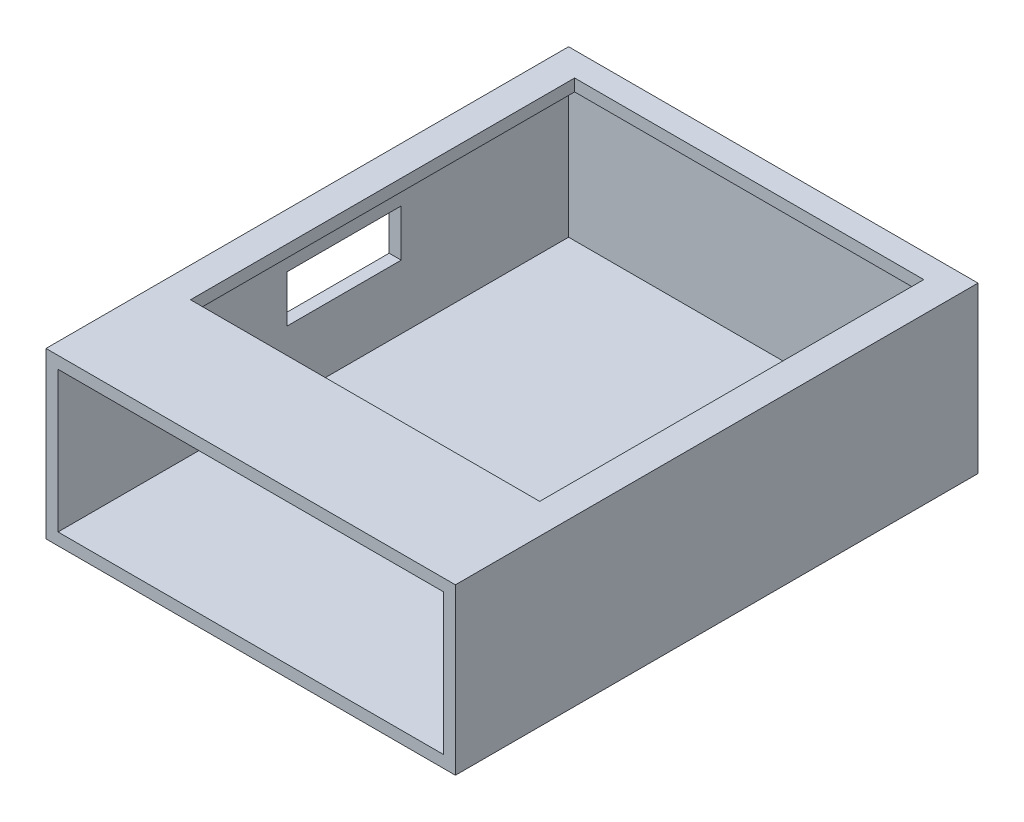
ISO-10303-21;
HEADER;
FILE_DESCRIPTION(('STEP AP214'),'2;1');
FILE_NAME('part.step','',(''),(''),'','','');
FILE_SCHEMA(('AUTOMOTIVE_DESIGN { 1 0 10303 214 1 1 1 1 }'));
ENDSEC;
DATA;
#1=APPLICATION_CONTEXT('core data for automotive mechanical design processes');
#2=APPLICATION_PROTOCOL_DEFINITION('international standard','automotive_design',2000,#1);
#3=PRODUCT_CONTEXT('',#1,'mechanical');
#4=PRODUCT('Part','Part','',(#3));
#5=PRODUCT_RELATED_PRODUCT_CATEGORY('part','',(#4));
#6=PRODUCT_DEFINITION_FORMATION('','',#4);
#7=PRODUCT_DEFINITION_CONTEXT('part definition',#1,'design');
#8=PRODUCT_DEFINITION('design','',#6,#7);
#9=PRODUCT_DEFINITION_SHAPE('','',#8);
#10=(LENGTH_UNIT() NAMED_UNIT(*) SI_UNIT(.MILLI.,.METRE.));
#11=(NAMED_UNIT(*) PLANE_ANGLE_UNIT() SI_UNIT($,.RADIAN.));
#12=(NAMED_UNIT(*) SI_UNIT($,.STERADIAN.) SOLID_ANGLE_UNIT());
#13=UNCERTAINTY_MEASURE_WITH_UNIT(LENGTH_MEASURE(1.E-05),#10,'distance_accuracy_value','');
#14=(GEOMETRIC_REPRESENTATION_CONTEXT(3) GLOBAL_UNCERTAINTY_ASSIGNED_CONTEXT((#13)) GLOBAL_UNIT_ASSIGNED_CONTEXT((#10,
#11,#12)) REPRESENTATION_CONTEXT('',''));
#15=CARTESIAN_POINT('',(0.,0.,0.));
#16=DIRECTION('',(0.,0.,1.));
#17=DIRECTION('',(1.,0.,0.));
#18=AXIS2_PLACEMENT_3D('',#15,#16,#17);
#19=CARTESIAN_POINT('',(-1.,11.7,-42.4));
#20=DIRECTION('',(1.,0.,0.));
#21=DIRECTION('',(0.,0.,-1.));
#22=AXIS2_PLACEMENT_3D('',#19,#20,#21);
#23=PLANE('',#22);
#24=DIRECTION('',(0.,0.,-1.));
#25=VECTOR('',#24,1.);
#26=CARTESIAN_POINT('',(-1.,5.3,-19.));
#27=LINE('',#26,#25);
#28=CARTESIAN_POINT('',(-1.,5.3,-19.));
#29=VERTEX_POINT('',#28);
#30=CARTESIAN_POINT('',(-1.,5.3,-28.5));
#31=VERTEX_POINT('',#30);
#32=EDGE_CURVE('E92',#29,#31,#27,.T.);
#33=ORIENTED_EDGE('',*,*,#32,.T.);
#34=DIRECTION('',(0.,1.,0.));
#35=VECTOR('',#34,1.);
#36=CARTESIAN_POINT('',(-1.,5.3,-28.5));
#37=LINE('',#36,#35);
#38=CARTESIAN_POINT('',(-1.,9.2,-28.5));
#39=VERTEX_POINT('',#38);
#40=EDGE_CURVE('E350',#31,#39,#37,.T.);
#41=ORIENTED_EDGE('',*,*,#40,.T.);
#42=DIRECTION('',(0.,0.,1.));
#43=VECTOR('',#42,1.);
#44=CARTESIAN_POINT('',(-1.,9.2,-28.5));
#45=LINE('',#44,#43);
#46=CARTESIAN_POINT('',(-1.,9.2,-19.));
#47=VERTEX_POINT('',#46);
#48=EDGE_CURVE('E346',#39,#47,#45,.T.);
#49=ORIENTED_EDGE('',*,*,#48,.T.);
#50=DIRECTION('',(0.,-1.,0.));
#51=VECTOR('',#50,1.);
#52=CARTESIAN_POINT('',(-1.,9.2,-19.));
#53=LINE('',#52,#51);
#54=EDGE_CURVE('E342',#47,#29,#53,.T.);
#55=ORIENTED_EDGE('',*,*,#54,.T.);
#56=EDGE_LOOP('',(#33,#41,#49,#55));
#57=FACE_BOUND('',#56,.T.);
#58=DIRECTION('',(0.,0.,1.));
#59=VECTOR('',#58,1.);
#60=CARTESIAN_POINT('',(-1.,-1.,-42.4));
#61=LINE('',#60,#59);
#62=CARTESIAN_POINT('',(-1.,-1.,-43.4));
#63=VERTEX_POINT('',#62);
#64=CARTESIAN_POINT('',(-1.,-1.,0.));
#65=VERTEX_POINT('',#64);
#66=EDGE_CURVE('E405',#63,#65,#61,.T.);
#67=ORIENTED_EDGE('',*,*,#66,.T.);
#68=DIRECTION('',(0.,-1.,0.));
#69=VECTOR('',#68,1.);
#70=CARTESIAN_POINT('',(-1.,11.7,0.));
#71=LINE('',#70,#69);
#72=CARTESIAN_POINT('',(-1.,12.7,0.));
#73=VERTEX_POINT('',#72);
#74=EDGE_CURVE('E12',#73,#65,#71,.T.);
#75=ORIENTED_EDGE('',*,*,#74,.F.);
#76=DIRECTION('',(0.,0.,1.));
#77=VECTOR('',#76,1.);
#78=CARTESIAN_POINT('',(-1.,12.7,-43.4));
#79=LINE('',#78,#77);
#80=CARTESIAN_POINT('',(-1.,12.7,-43.4));
#81=VERTEX_POINT('',#80);
#82=EDGE_CURVE('E272',#81,#73,#79,.T.);
#83=ORIENTED_EDGE('',*,*,#82,.F.);
#84=DIRECTION('',(0.,-1.,0.));
#85=VECTOR('',#84,1.);
#86=CARTESIAN_POINT('',(-1.,11.7,-43.4));
#87=LINE('',#86,#85);
#88=EDGE_CURVE('E410',#81,#63,#87,.T.);
#89=ORIENTED_EDGE('',*,*,#88,.T.);
#90=EDGE_LOOP('',(#67,#75,#83,#89));
#91=FACE_BOUND('',#90,.T.);
#92=DIRECTION('',(0.,1.,0.));
#93=VECTOR('',#92,1.);
#94=CARTESIAN_POINT('',(-1.,6.1,-12.85));
#95=LINE('',#94,#93);
#96=CARTESIAN_POINT('',(-1.,6.1,-12.85));
#97=VERTEX_POINT('',#96);
#98=CARTESIAN_POINT('',(-1.,8.3,-12.85));
#99=VERTEX_POINT('',#98);
#100=EDGE_CURVE('E84',#97,#99,#95,.T.);
#101=ORIENTED_EDGE('',*,*,#100,.T.);
#102=DIRECTION('',(0.,0.,1.));
#103=VECTOR('',#102,1.);
#104=CARTESIAN_POINT('',(-1.,8.3,-11.25));
#105=LINE('',#104,#103);
#106=CARTESIAN_POINT('',(-1.,8.3,-9.65));
#107=VERTEX_POINT('',#106);
#108=EDGE_CURVE('E298',#99,#107,#105,.T.);
#109=ORIENTED_EDGE('',*,*,#108,.T.);
#110=DIRECTION('',(0.,-1.,0.));
#111=VECTOR('',#110,1.);
#112=CARTESIAN_POINT('',(-1.,8.3,-9.65));
#113=LINE('',#112,#111);
#114=CARTESIAN_POINT('',(-1.,6.1,-9.65));
#115=VERTEX_POINT('',#114);
#116=EDGE_CURVE('E302',#107,#115,#113,.T.);
#117=ORIENTED_EDGE('',*,*,#116,.T.);
#118=DIRECTION('',(0.,0.,-1.));
#119=VECTOR('',#118,1.);
#120=CARTESIAN_POINT('',(-1.,6.1,-9.65));
#121=LINE('',#120,#119);
#122=EDGE_CURVE('E306',#115,#97,#121,.T.);
#123=ORIENTED_EDGE('',*,*,#122,.T.);
#124=EDGE_LOOP('',(#101,#109,#117,#123));
#125=FACE_BOUND('',#124,.T.);
#126=ADVANCED_FACE('F67',(#57,#91,#125),#23,.F.);
#127=CARTESIAN_POINT('',(0.,11.7,-42.4));
#128=DIRECTION('',(1.,0.,0.));
#129=DIRECTION('',(0.,0.,-1.));
#130=AXIS2_PLACEMENT_3D('',#127,#128,#129);
#131=PLANE('',#130);
#132=DIRECTION('',(0.,0.,1.));
#133=VECTOR('',#132,1.);
#134=CARTESIAN_POINT('',(0.,0.,-42.4));
#135=LINE('',#134,#133);
#136=CARTESIAN_POINT('',(0.,0.,-42.4));
#137=VERTEX_POINT('',#136);
#138=CARTESIAN_POINT('',(0.,0.,0.));
#139=VERTEX_POINT('',#138);
#140=EDGE_CURVE('E326',#137,#139,#135,.T.);
#141=ORIENTED_EDGE('',*,*,#140,.F.);
#142=DIRECTION('',(0.,-1.,0.));
#143=VECTOR('',#142,1.);
#144=CARTESIAN_POINT('',(0.,11.7,-42.4));
#145=LINE('',#144,#143);
#146=CARTESIAN_POINT('',(0.,11.7,-42.4));
#147=VERTEX_POINT('',#146);
#148=EDGE_CURVE('E379',#147,#137,#145,.T.);
#149=ORIENTED_EDGE('',*,*,#148,.F.);
#150=DIRECTION('',(0.,0.,1.));
#151=VECTOR('',#150,1.);
#152=CARTESIAN_POINT('',(0.,11.7,-42.4));
#153=LINE('',#152,#151);
#154=CARTESIAN_POINT('',(0.,11.7,0.));
#155=VERTEX_POINT('',#154);
#156=EDGE_CURVE('E366',#147,#155,#153,.T.);
#157=ORIENTED_EDGE('',*,*,#156,.T.);
#158=DIRECTION('',(0.,-1.,0.));
#159=VECTOR('',#158,1.);
#160=CARTESIAN_POINT('',(0.,11.7,0.));
#161=LINE('',#160,#159);
#162=EDGE_CURVE('E402',#155,#139,#161,.T.);
#163=ORIENTED_EDGE('',*,*,#162,.T.);
#164=EDGE_LOOP('',(#141,#149,#157,#163));
#165=FACE_BOUND('',#164,.T.);
#166=DIRECTION('',(0.,1.,0.));
#167=VECTOR('',#166,1.);
#168=CARTESIAN_POINT('',(0.,5.3,-28.5));
#169=LINE('',#168,#167);
#170=CARTESIAN_POINT('',(0.,5.3,-28.5));
#171=VERTEX_POINT('',#170);
#172=CARTESIAN_POINT('',(0.,9.2,-28.5));
#173=VERTEX_POINT('',#172);
#174=EDGE_CURVE('E360',#171,#173,#169,.T.);
#175=ORIENTED_EDGE('',*,*,#174,.F.);
#176=DIRECTION('',(0.,0.,-1.));
#177=VECTOR('',#176,1.);
#178=CARTESIAN_POINT('',(0.,5.3,-19.));
#179=LINE('',#178,#177);
#180=CARTESIAN_POINT('',(0.,5.3,-19.));
#181=VERTEX_POINT('',#180);
#182=EDGE_CURVE('E356',#181,#171,#179,.T.);
#183=ORIENTED_EDGE('',*,*,#182,.F.);
#184=DIRECTION('',(0.,-1.,0.));
#185=VECTOR('',#184,1.);
#186=CARTESIAN_POINT('',(0.,9.2,-19.));
#187=LINE('',#186,#185);
#188=CARTESIAN_POINT('',(0.,9.2,-19.));
#189=VERTEX_POINT('',#188);
#190=EDGE_CURVE('E280',#189,#181,#187,.T.);
#191=ORIENTED_EDGE('',*,*,#190,.F.);
#192=DIRECTION('',(0.,0.,1.));
#193=VECTOR('',#192,1.);
#194=CARTESIAN_POINT('',(0.,9.2,-28.5));
#195=LINE('',#194,#193);
#196=EDGE_CURVE('E288',#173,#189,#195,.T.);
#197=ORIENTED_EDGE('',*,*,#196,.F.);
#198=EDGE_LOOP('',(#175,#183,#191,#197));
#199=FACE_BOUND('',#198,.T.);
#200=DIRECTION('',(0.,0.,1.));
#201=VECTOR('',#200,1.);
#202=CARTESIAN_POINT('',(0.,8.3,-11.25));
#203=LINE('',#202,#201);
#204=CARTESIAN_POINT('',(0.,8.3,-12.85));
#205=VERTEX_POINT('',#204);
#206=CARTESIAN_POINT('',(0.,8.3,-9.65));
#207=VERTEX_POINT('',#206);
#208=EDGE_CURVE('E287',#205,#207,#203,.T.);
#209=ORIENTED_EDGE('',*,*,#208,.F.);
#210=DIRECTION('',(0.,1.,0.));
#211=VECTOR('',#210,1.);
#212=CARTESIAN_POINT('',(0.,6.1,-12.85));
#213=LINE('',#212,#211);
#214=CARTESIAN_POINT('',(0.,6.1,-12.85));
#215=VERTEX_POINT('',#214);
#216=EDGE_CURVE('E292',#215,#205,#213,.T.);
#217=ORIENTED_EDGE('',*,*,#216,.F.);
#218=DIRECTION('',(0.,0.,-1.));
#219=VECTOR('',#218,1.);
#220=CARTESIAN_POINT('',(0.,6.1,-9.65));
#221=LINE('',#220,#219);
#222=CARTESIAN_POINT('',(0.,6.1,-9.65000000000001));
#223=VERTEX_POINT('',#222);
#224=EDGE_CURVE('E322',#223,#215,#221,.T.);
#225=ORIENTED_EDGE('',*,*,#224,.F.);
#226=DIRECTION('',(0.,-1.,0.));
#227=VECTOR('',#226,1.);
#228=CARTESIAN_POINT('',(0.,8.3,-9.65));
#229=LINE('',#228,#227);
#230=EDGE_CURVE('E284',#207,#223,#229,.T.);
#231=ORIENTED_EDGE('',*,*,#230,.F.);
#232=EDGE_LOOP('',(#209,#217,#225,#231));
#233=FACE_BOUND('',#232,.T.);
#234=ADVANCED_FACE('F458',(#165,#199,#233),#131,.T.);
#235=CARTESIAN_POINT('',(0.,11.7,0.));
#236=DIRECTION('',(0.,0.,-1.));
#237=DIRECTION('',(-1.,0.,0.));
#238=AXIS2_PLACEMENT_3D('',#235,#236,#237);
#239=PLANE('',#238);
#240=DIRECTION('',(0.,-1.,0.));
#241=VECTOR('',#240,1.);
#242=CARTESIAN_POINT('',(33.,11.7,0.));
#243=LINE('',#242,#241);
#244=CARTESIAN_POINT('',(33.,12.7,0.));
#245=VERTEX_POINT('',#244);
#246=CARTESIAN_POINT('',(33.,-1.,0.));
#247=VERTEX_POINT('',#246);
#248=EDGE_CURVE('E71',#245,#247,#243,.T.);
#249=ORIENTED_EDGE('',*,*,#248,.F.);
#250=DIRECTION('',(1.,0.,0.));
#251=VECTOR('',#250,1.);
#252=CARTESIAN_POINT('',(-1.,12.7,0.));
#253=LINE('',#252,#251);
#254=EDGE_CURVE('E276',#73,#245,#253,.T.);
#255=ORIENTED_EDGE('',*,*,#254,.F.);
#256=ORIENTED_EDGE('',*,*,#74,.T.);
#257=DIRECTION('',(1.,0.,0.));
#258=VECTOR('',#257,1.);
#259=CARTESIAN_POINT('',(0.,-1.,0.));
#260=LINE('',#259,#258);
#261=EDGE_CURVE('E409',#65,#247,#260,.T.);
#262=ORIENTED_EDGE('',*,*,#261,.T.);
#263=EDGE_LOOP('',(#249,#255,#256,#262));
#264=FACE_BOUND('',#263,.T.);
#265=DIRECTION('',(1.,0.,0.));
#266=VECTOR('',#265,1.);
#267=CARTESIAN_POINT('',(-1.,11.7,0.));
#268=LINE('',#267,#266);
#269=CARTESIAN_POINT('',(32.,11.7,0.));
#270=VERTEX_POINT('',#269);
#271=EDGE_CURVE('E258',#155,#270,#268,.T.);
#272=ORIENTED_EDGE('',*,*,#271,.T.);
#273=DIRECTION('',(0.,-1.,0.));
#274=VECTOR('',#273,1.);
#275=CARTESIAN_POINT('',(32.,11.7,0.));
#276=LINE('',#275,#274);
#277=CARTESIAN_POINT('',(32.,0.,0.));
#278=VERTEX_POINT('',#277);
#279=EDGE_CURVE('E398',#270,#278,#276,.T.);
#280=ORIENTED_EDGE('',*,*,#279,.T.);
#281=DIRECTION('',(1.,0.,0.));
#282=VECTOR('',#281,1.);
#283=CARTESIAN_POINT('',(0.,0.,0.));
#284=LINE('',#283,#282);
#285=EDGE_CURVE('E383',#139,#278,#284,.T.);
#286=ORIENTED_EDGE('',*,*,#285,.F.);
#287=ORIENTED_EDGE('',*,*,#162,.F.);
#288=EDGE_LOOP('',(#272,#280,#286,#287));
#289=FACE_BOUND('',#288,.T.);
#290=ADVANCED_FACE('F426',(#264,#289),#239,.F.);
#291=CARTESIAN_POINT('',(33.,11.7,0.));
#292=DIRECTION('',(-1.,0.,0.));
#293=DIRECTION('',(0.,0.,1.));
#294=AXIS2_PLACEMENT_3D('',#291,#292,#293);
#295=PLANE('',#294);
#296=DIRECTION('',(0.,0.,-1.));
#297=VECTOR('',#296,1.);
#298=CARTESIAN_POINT('',(33.,-1.,0.));
#299=LINE('',#298,#297);
#300=CARTESIAN_POINT('',(33.,-1.,-43.4));
#301=VERTEX_POINT('',#300);
#302=EDGE_CURVE('E417',#247,#301,#299,.T.);
#303=ORIENTED_EDGE('',*,*,#302,.T.);
#304=DIRECTION('',(0.,-1.,0.));
#305=VECTOR('',#304,1.);
#306=CARTESIAN_POINT('',(33.,11.7,-43.4));
#307=LINE('',#306,#305);
#308=CARTESIAN_POINT('',(33.,12.7,-43.4));
#309=VERTEX_POINT('',#308);
#310=EDGE_CURVE('E414',#309,#301,#307,.T.);
#311=ORIENTED_EDGE('',*,*,#310,.F.);
#312=DIRECTION('',(0.,0.,-1.));
#313=VECTOR('',#312,1.);
#314=CARTESIAN_POINT('',(33.,12.7,0.));
#315=LINE('',#314,#313);
#316=EDGE_CURVE('E264',#245,#309,#315,.T.);
#317=ORIENTED_EDGE('',*,*,#316,.F.);
#318=ORIENTED_EDGE('',*,*,#248,.T.);
#319=EDGE_LOOP('',(#303,#311,#317,#318));
#320=FACE_BOUND('',#319,.T.);
#321=ADVANCED_FACE('F434',(#320),#295,.F.);
#322=CARTESIAN_POINT('',(32.,11.7,-43.4));
#323=DIRECTION('',(0.,0.,1.));
#324=DIRECTION('',(1.,0.,0.));
#325=AXIS2_PLACEMENT_3D('',#322,#323,#324);
#326=PLANE('',#325);
#327=DIRECTION('',(-1.,0.,0.));
#328=VECTOR('',#327,1.);
#329=CARTESIAN_POINT('',(32.,-1.,-43.4));
#330=LINE('',#329,#328);
#331=EDGE_CURVE('E415',#301,#63,#330,.T.);
#332=ORIENTED_EDGE('',*,*,#331,.T.);
#333=ORIENTED_EDGE('',*,*,#88,.F.);
#334=DIRECTION('',(-1.,0.,0.));
#335=VECTOR('',#334,1.);
#336=CARTESIAN_POINT('',(33.,12.7,-43.4));
#337=LINE('',#336,#335);
#338=EDGE_CURVE('E268',#309,#81,#337,.T.);
#339=ORIENTED_EDGE('',*,*,#338,.F.);
#340=ORIENTED_EDGE('',*,*,#310,.T.);
#341=EDGE_LOOP('',(#332,#333,#339,#340));
#342=FACE_BOUND('',#341,.T.);
#343=ADVANCED_FACE('F438',(#342),#326,.F.);
#344=CARTESIAN_POINT('',(0.,-1.,0.));
#345=DIRECTION('',(0.,1.,0.));
#346=DIRECTION('',(0.,0.,1.));
#347=AXIS2_PLACEMENT_3D('',#344,#345,#346);
#348=PLANE('',#347);
#349=ORIENTED_EDGE('',*,*,#66,.F.);
#350=ORIENTED_EDGE('',*,*,#331,.F.);
#351=ORIENTED_EDGE('',*,*,#302,.F.);
#352=ORIENTED_EDGE('',*,*,#261,.F.);
#353=EDGE_LOOP('',(#349,#350,#351,#352));
#354=FACE_BOUND('',#353,.T.);
#355=ADVANCED_FACE('F69',(#354),#348,.F.);
#356=CARTESIAN_POINT('',(32.,11.7,0.));
#357=DIRECTION('',(-1.,0.,0.));
#358=DIRECTION('',(0.,0.,1.));
#359=AXIS2_PLACEMENT_3D('',#356,#357,#358);
#360=PLANE('',#359);
#361=DIRECTION('',(0.,0.,-1.));
#362=VECTOR('',#361,1.);
#363=CARTESIAN_POINT('',(32.,0.,0.));
#364=LINE('',#363,#362);
#365=CARTESIAN_POINT('',(32.,0.,-42.4));
#366=VERTEX_POINT('',#365);
#367=EDGE_CURVE('E386',#278,#366,#364,.T.);
#368=ORIENTED_EDGE('',*,*,#367,.F.);
#369=ORIENTED_EDGE('',*,*,#279,.F.);
#370=DIRECTION('',(0.,0.,-1.));
#371=VECTOR('',#370,1.);
#372=CARTESIAN_POINT('',(32.,11.7,0.));
#373=LINE('',#372,#371);
#374=CARTESIAN_POINT('',(32.,11.7,-42.4));
#375=VERTEX_POINT('',#374);
#376=EDGE_CURVE('E370',#270,#375,#373,.T.);
#377=ORIENTED_EDGE('',*,*,#376,.T.);
#378=DIRECTION('',(0.,-1.,0.));
#379=VECTOR('',#378,1.);
#380=CARTESIAN_POINT('',(32.,11.7,-42.4));
#381=LINE('',#380,#379);
#382=EDGE_CURVE('E394',#375,#366,#381,.T.);
#383=ORIENTED_EDGE('',*,*,#382,.T.);
#384=EDGE_LOOP('',(#368,#369,#377,#383));
#385=FACE_BOUND('',#384,.T.);
#386=ADVANCED_FACE('F476',(#385),#360,.T.);
#387=CARTESIAN_POINT('',(32.,11.7,-42.4));
#388=DIRECTION('',(0.,0.,1.));
#389=DIRECTION('',(1.,0.,0.));
#390=AXIS2_PLACEMENT_3D('',#387,#388,#389);
#391=PLANE('',#390);
#392=DIRECTION('',(-1.,0.,0.));
#393=VECTOR('',#392,1.);
#394=CARTESIAN_POINT('',(32.,0.,-42.4));
#395=LINE('',#394,#393);
#396=EDGE_CURVE('E371',#366,#137,#395,.T.);
#397=ORIENTED_EDGE('',*,*,#396,.F.);
#398=ORIENTED_EDGE('',*,*,#382,.F.);
#399=DIRECTION('',(-1.,0.,0.));
#400=VECTOR('',#399,1.);
#401=CARTESIAN_POINT('',(32.,11.7,-42.4));
#402=LINE('',#401,#400);
#403=EDGE_CURVE('E375',#375,#147,#402,.T.);
#404=ORIENTED_EDGE('',*,*,#403,.T.);
#405=ORIENTED_EDGE('',*,*,#148,.T.);
#406=EDGE_LOOP('',(#397,#398,#404,#405));
#407=FACE_BOUND('',#406,.T.);
#408=ADVANCED_FACE('F479',(#407),#391,.T.);
#409=CARTESIAN_POINT('',(0.,0.,0.));
#410=DIRECTION('',(0.,1.,0.));
#411=DIRECTION('',(0.,0.,1.));
#412=AXIS2_PLACEMENT_3D('',#409,#410,#411);
#413=PLANE('',#412);
#414=ORIENTED_EDGE('',*,*,#140,.T.);
#415=ORIENTED_EDGE('',*,*,#285,.T.);
#416=ORIENTED_EDGE('',*,*,#367,.T.);
#417=ORIENTED_EDGE('',*,*,#396,.T.);
#418=EDGE_LOOP('',(#414,#415,#416,#417));
#419=FACE_BOUND('',#418,.T.);
#420=ADVANCED_FACE('F484',(#419),#413,.T.);
#421=CARTESIAN_POINT('',(33.001,5.3,-19.));
#422=DIRECTION('',(0.,1.,0.));
#423=DIRECTION('',(0.,0.,1.));
#424=AXIS2_PLACEMENT_3D('',#421,#422,#423);
#425=PLANE('',#424);
#426=ORIENTED_EDGE('',*,*,#182,.T.);
#427=DIRECTION('',(-1.,0.,0.));
#428=VECTOR('',#427,1.);
#429=CARTESIAN_POINT('',(33.001,5.3,-28.5));
#430=LINE('',#429,#428);
#431=EDGE_CURVE('E330',#171,#31,#430,.T.);
#432=ORIENTED_EDGE('',*,*,#431,.T.);
#433=ORIENTED_EDGE('',*,*,#32,.F.);
#434=DIRECTION('',(-1.,0.,0.));
#435=VECTOR('',#434,1.);
#436=CARTESIAN_POINT('',(33.001,5.3,-19.));
#437=LINE('',#436,#435);
#438=EDGE_CURVE('E339',#181,#29,#437,.T.);
#439=ORIENTED_EDGE('',*,*,#438,.F.);
#440=EDGE_LOOP('',(#426,#432,#433,#439));
#441=FACE_BOUND('',#440,.T.);
#442=ADVANCED_FACE('F491',(#441),#425,.T.);
#443=CARTESIAN_POINT('',(33.001,5.3,-28.5));
#444=DIRECTION('',(0.,0.,1.));
#445=DIRECTION('',(1.,0.,0.));
#446=AXIS2_PLACEMENT_3D('',#443,#444,#445);
#447=PLANE('',#446);
#448=ORIENTED_EDGE('',*,*,#174,.T.);
#449=DIRECTION('',(-1.,0.,0.));
#450=VECTOR('',#449,1.);
#451=CARTESIAN_POINT('',(33.001,9.2,-28.5));
#452=LINE('',#451,#450);
#453=EDGE_CURVE('E333',#173,#39,#452,.T.);
#454=ORIENTED_EDGE('',*,*,#453,.T.);
#455=ORIENTED_EDGE('',*,*,#40,.F.);
#456=ORIENTED_EDGE('',*,*,#431,.F.);
#457=EDGE_LOOP('',(#448,#454,#455,#456));
#458=FACE_BOUND('',#457,.T.);
#459=ADVANCED_FACE('F501',(#458),#447,.T.);
#460=CARTESIAN_POINT('',(33.001,9.2,-28.5));
#461=DIRECTION('',(0.,-1.,0.));
#462=DIRECTION('',(0.,0.,-1.));
#463=AXIS2_PLACEMENT_3D('',#460,#461,#462);
#464=PLANE('',#463);
#465=ORIENTED_EDGE('',*,*,#196,.T.);
#466=DIRECTION('',(-1.,0.,0.));
#467=VECTOR('',#466,1.);
#468=CARTESIAN_POINT('',(33.001,9.2,-19.));
#469=LINE('',#468,#467);
#470=EDGE_CURVE('E336',#189,#47,#469,.T.);
#471=ORIENTED_EDGE('',*,*,#470,.T.);
#472=ORIENTED_EDGE('',*,*,#48,.F.);
#473=ORIENTED_EDGE('',*,*,#453,.F.);
#474=EDGE_LOOP('',(#465,#471,#472,#473));
#475=FACE_BOUND('',#474,.T.);
#476=ADVANCED_FACE('F497',(#475),#464,.T.);
#477=CARTESIAN_POINT('',(33.001,9.2,-19.));
#478=DIRECTION('',(0.,0.,-1.));
#479=DIRECTION('',(-1.,0.,0.));
#480=AXIS2_PLACEMENT_3D('',#477,#478,#479);
#481=PLANE('',#480);
#482=ORIENTED_EDGE('',*,*,#190,.T.);
#483=ORIENTED_EDGE('',*,*,#438,.T.);
#484=ORIENTED_EDGE('',*,*,#54,.F.);
#485=ORIENTED_EDGE('',*,*,#470,.F.);
#486=EDGE_LOOP('',(#482,#483,#484,#485));
#487=FACE_BOUND('',#486,.T.);
#488=ADVANCED_FACE('F493',(#487),#481,.T.);
#489=CARTESIAN_POINT('',(33.001,6.1,-12.85));
#490=DIRECTION('',(0.,0.,1.));
#491=DIRECTION('',(1.,0.,0.));
#492=AXIS2_PLACEMENT_3D('',#489,#490,#491);
#493=PLANE('',#492);
#494=ORIENTED_EDGE('',*,*,#216,.T.);
#495=DIRECTION('',(-1.,0.,0.));
#496=VECTOR('',#495,1.);
#497=CARTESIAN_POINT('',(33.001,8.3,-12.85));
#498=LINE('',#497,#496);
#499=EDGE_CURVE('E319',#205,#99,#498,.T.);
#500=ORIENTED_EDGE('',*,*,#499,.T.);
#501=ORIENTED_EDGE('',*,*,#100,.F.);
#502=DIRECTION('',(-1.,0.,0.));
#503=VECTOR('',#502,1.);
#504=CARTESIAN_POINT('',(33.001,6.1,-12.85));
#505=LINE('',#504,#503);
#506=EDGE_CURVE('E310',#215,#97,#505,.T.);
#507=ORIENTED_EDGE('',*,*,#506,.F.);
#508=EDGE_LOOP('',(#494,#500,#501,#507));
#509=FACE_BOUND('',#508,.T.);
#510=ADVANCED_FACE('F496',(#509),#493,.T.);
#511=CARTESIAN_POINT('',(33.001,8.3,-11.25));
#512=DIRECTION('',(0.,-1.,0.));
#513=DIRECTION('',(0.,0.,-1.));
#514=AXIS2_PLACEMENT_3D('',#511,#512,#513);
#515=PLANE('',#514);
#516=ORIENTED_EDGE('',*,*,#208,.T.);
#517=DIRECTION('',(-1.,0.,0.));
#518=VECTOR('',#517,1.);
#519=CARTESIAN_POINT('',(33.001,8.3,-9.65));
#520=LINE('',#519,#518);
#521=EDGE_CURVE('E316',#207,#107,#520,.T.);
#522=ORIENTED_EDGE('',*,*,#521,.T.);
#523=ORIENTED_EDGE('',*,*,#108,.F.);
#524=ORIENTED_EDGE('',*,*,#499,.F.);
#525=EDGE_LOOP('',(#516,#522,#523,#524));
#526=FACE_BOUND('',#525,.T.);
#527=ADVANCED_FACE('F509',(#526),#515,.T.);
#528=CARTESIAN_POINT('',(33.001,8.3,-9.65));
#529=DIRECTION('',(0.,0.,-1.));
#530=DIRECTION('',(-1.,0.,0.));
#531=AXIS2_PLACEMENT_3D('',#528,#529,#530);
#532=PLANE('',#531);
#533=ORIENTED_EDGE('',*,*,#230,.T.);
#534=DIRECTION('',(-1.,0.,0.));
#535=VECTOR('',#534,1.);
#536=CARTESIAN_POINT('',(33.001,6.1,-9.65));
#537=LINE('',#536,#535);
#538=EDGE_CURVE('E313',#223,#115,#537,.T.);
#539=ORIENTED_EDGE('',*,*,#538,.T.);
#540=ORIENTED_EDGE('',*,*,#116,.F.);
#541=ORIENTED_EDGE('',*,*,#521,.F.);
#542=EDGE_LOOP('',(#533,#539,#540,#541));
#543=FACE_BOUND('',#542,.T.);
#544=ADVANCED_FACE('F453',(#543),#532,.T.);
#545=CARTESIAN_POINT('',(33.001,6.1,-9.65));
#546=DIRECTION('',(0.,1.,0.));
#547=DIRECTION('',(0.,0.,1.));
#548=AXIS2_PLACEMENT_3D('',#545,#546,#547);
#549=PLANE('',#548);
#550=ORIENTED_EDGE('',*,*,#224,.T.);
#551=ORIENTED_EDGE('',*,*,#506,.T.);
#552=ORIENTED_EDGE('',*,*,#122,.F.);
#553=ORIENTED_EDGE('',*,*,#538,.F.);
#554=EDGE_LOOP('',(#550,#551,#552,#553));
#555=FACE_BOUND('',#554,.T.);
#556=ADVANCED_FACE('F445',(#555),#549,.T.);
#557=CARTESIAN_POINT('',(0.,12.7,0.));
#558=DIRECTION('',(0.,1.,0.));
#559=DIRECTION('',(0.,0.,1.));
#560=AXIS2_PLACEMENT_3D('',#557,#558,#559);
#561=PLANE('',#560);
#562=DIRECTION('',(0.,0.,1.));
#563=VECTOR('',#562,1.);
#564=CARTESIAN_POINT('',(30.5,12.7,-41.4));
#565=LINE('',#564,#563);
#566=CARTESIAN_POINT('',(30.5,12.7,-41.4));
#567=VERTEX_POINT('',#566);
#568=CARTESIAN_POINT('',(30.5,12.7,-9.5));
#569=VERTEX_POINT('',#568);
#570=EDGE_CURVE('E210',#567,#569,#565,.T.);
#571=ORIENTED_EDGE('',*,*,#570,.T.);
#572=DIRECTION('',(-1.,0.,0.));
#573=VECTOR('',#572,1.);
#574=CARTESIAN_POINT('',(30.5,12.7,-9.5));
#575=LINE('',#574,#573);
#576=CARTESIAN_POINT('',(1.5,12.7,-9.5));
#577=VERTEX_POINT('',#576);
#578=EDGE_CURVE('E222',#569,#577,#575,.T.);
#579=ORIENTED_EDGE('',*,*,#578,.T.);
#580=DIRECTION('',(0.,0.,1.));
#581=VECTOR('',#580,1.);
#582=CARTESIAN_POINT('',(1.5,12.7,-41.4));
#583=LINE('',#582,#581);
#584=CARTESIAN_POINT('',(1.5,12.7,-41.4));
#585=VERTEX_POINT('',#584);
#586=EDGE_CURVE('E228',#585,#577,#583,.T.);
#587=ORIENTED_EDGE('',*,*,#586,.F.);
#588=DIRECTION('',(1.,0.,0.));
#589=VECTOR('',#588,1.);
#590=CARTESIAN_POINT('',(1.5,12.7,-41.4));
#591=LINE('',#590,#589);
#592=EDGE_CURVE('E219',#585,#567,#591,.T.);
#593=ORIENTED_EDGE('',*,*,#592,.T.);
#594=EDGE_LOOP('',(#571,#579,#587,#593));
#595=FACE_BOUND('',#594,.T.);
#596=ORIENTED_EDGE('',*,*,#316,.T.);
#597=ORIENTED_EDGE('',*,*,#338,.T.);
#598=ORIENTED_EDGE('',*,*,#82,.T.);
#599=ORIENTED_EDGE('',*,*,#254,.T.);
#600=EDGE_LOOP('',(#596,#597,#598,#599));
#601=FACE_BOUND('',#600,.T.);
#602=ADVANCED_FACE('F230',(#595,#601),#561,.T.);
#603=CARTESIAN_POINT('',(0.,11.7,0.));
#604=DIRECTION('',(0.,1.,0.));
#605=DIRECTION('',(0.,0.,1.));
#606=AXIS2_PLACEMENT_3D('',#603,#604,#605);
#607=PLANE('',#606);
#608=ORIENTED_EDGE('',*,*,#156,.F.);
#609=ORIENTED_EDGE('',*,*,#403,.F.);
#610=ORIENTED_EDGE('',*,*,#376,.F.);
#611=ORIENTED_EDGE('',*,*,#271,.F.);
#612=EDGE_LOOP('',(#608,#609,#610,#611));
#613=FACE_BOUND('',#612,.T.);
#614=DIRECTION('',(-1.,0.,0.));
#615=VECTOR('',#614,1.);
#616=CARTESIAN_POINT('',(30.5,11.7,-9.5));
#617=LINE('',#616,#615);
#618=CARTESIAN_POINT('',(30.5,11.7,-9.5));
#619=VERTEX_POINT('',#618);
#620=CARTESIAN_POINT('',(1.5,11.7,-9.5));
#621=VERTEX_POINT('',#620);
#622=EDGE_CURVE('E249',#619,#621,#617,.T.);
#623=ORIENTED_EDGE('',*,*,#622,.F.);
#624=DIRECTION('',(0.,0.,1.));
#625=VECTOR('',#624,1.);
#626=CARTESIAN_POINT('',(30.5,11.7,-41.4));
#627=LINE('',#626,#625);
#628=CARTESIAN_POINT('',(30.5,11.7,-41.4));
#629=VERTEX_POINT('',#628);
#630=EDGE_CURVE('E213',#629,#619,#627,.T.);
#631=ORIENTED_EDGE('',*,*,#630,.F.);
#632=DIRECTION('',(1.,0.,0.));
#633=VECTOR('',#632,1.);
#634=CARTESIAN_POINT('',(1.5,11.7,-41.4));
#635=LINE('',#634,#633);
#636=CARTESIAN_POINT('',(1.5,11.7,-41.4));
#637=VERTEX_POINT('',#636);
#638=EDGE_CURVE('E234',#637,#629,#635,.T.);
#639=ORIENTED_EDGE('',*,*,#638,.F.);
#640=DIRECTION('',(0.,0.,1.));
#641=VECTOR('',#640,1.);
#642=CARTESIAN_POINT('',(1.5,11.7,-41.4));
#643=LINE('',#642,#641);
#644=EDGE_CURVE('E241',#637,#621,#643,.T.);
#645=ORIENTED_EDGE('',*,*,#644,.T.);
#646=EDGE_LOOP('',(#623,#631,#639,#645));
#647=FACE_BOUND('',#646,.T.);
#648=ADVANCED_FACE('F444',(#613,#647),#607,.F.);
#649=CARTESIAN_POINT('',(30.5,12.7,-41.4));
#650=DIRECTION('',(1.,0.,0.));
#651=DIRECTION('',(0.,0.,-1.));
#652=AXIS2_PLACEMENT_3D('',#649,#650,#651);
#653=PLANE('',#652);
#654=ORIENTED_EDGE('',*,*,#630,.T.);
#655=DIRECTION('',(0.,-1.,0.));
#656=VECTOR('',#655,1.);
#657=CARTESIAN_POINT('',(30.5,12.7,-9.5));
#658=LINE('',#657,#656);
#659=EDGE_CURVE('E206',#569,#619,#658,.T.);
#660=ORIENTED_EDGE('',*,*,#659,.F.);
#661=ORIENTED_EDGE('',*,*,#570,.F.);
#662=DIRECTION('',(0.,-1.,0.));
#663=VECTOR('',#662,1.);
#664=CARTESIAN_POINT('',(30.5,12.7,-41.4));
#665=LINE('',#664,#663);
#666=EDGE_CURVE('E255',#567,#629,#665,.T.);
#667=ORIENTED_EDGE('',*,*,#666,.T.);
#668=EDGE_LOOP('',(#654,#660,#661,#667));
#669=FACE_BOUND('',#668,.T.);
#670=ADVANCED_FACE('F208',(#669),#653,.F.);
#671=CARTESIAN_POINT('',(1.5,12.7,-41.4));
#672=DIRECTION('',(0.,0.,-1.));
#673=DIRECTION('',(-1.,0.,0.));
#674=AXIS2_PLACEMENT_3D('',#671,#672,#673);
#675=PLANE('',#674);
#676=ORIENTED_EDGE('',*,*,#638,.T.);
#677=ORIENTED_EDGE('',*,*,#666,.F.);
#678=ORIENTED_EDGE('',*,*,#592,.F.);
#679=DIRECTION('',(0.,-1.,0.));
#680=VECTOR('',#679,1.);
#681=CARTESIAN_POINT('',(1.5,12.7,-41.4));
#682=LINE('',#681,#680);
#683=EDGE_CURVE('E259',#585,#637,#682,.T.);
#684=ORIENTED_EDGE('',*,*,#683,.T.);
#685=EDGE_LOOP('',(#676,#677,#678,#684));
#686=FACE_BOUND('',#685,.T.);
#687=ADVANCED_FACE('F548',(#686),#675,.F.);
#688=CARTESIAN_POINT('',(1.5,12.7,-41.4));
#689=DIRECTION('',(1.,0.,0.));
#690=DIRECTION('',(0.,0.,-1.));
#691=AXIS2_PLACEMENT_3D('',#688,#689,#690);
#692=PLANE('',#691);
#693=ORIENTED_EDGE('',*,*,#644,.F.);
#694=ORIENTED_EDGE('',*,*,#683,.F.);
#695=ORIENTED_EDGE('',*,*,#586,.T.);
#696=DIRECTION('',(0.,-1.,0.));
#697=VECTOR('',#696,1.);
#698=CARTESIAN_POINT('',(1.5,12.7,-9.5));
#699=LINE('',#698,#697);
#700=EDGE_CURVE('E218',#577,#621,#699,.T.);
#701=ORIENTED_EDGE('',*,*,#700,.T.);
#702=EDGE_LOOP('',(#693,#694,#695,#701));
#703=FACE_BOUND('',#702,.T.);
#704=ADVANCED_FACE('F555',(#703),#692,.T.);
#705=CARTESIAN_POINT('',(30.5,12.7,-9.5));
#706=DIRECTION('',(0.,0.,1.));
#707=DIRECTION('',(1.,0.,0.));
#708=AXIS2_PLACEMENT_3D('',#705,#706,#707);
#709=PLANE('',#708);
#710=ORIENTED_EDGE('',*,*,#622,.T.);
#711=ORIENTED_EDGE('',*,*,#700,.F.);
#712=ORIENTED_EDGE('',*,*,#578,.F.);
#713=ORIENTED_EDGE('',*,*,#659,.T.);
#714=EDGE_LOOP('',(#710,#711,#712,#713));
#715=FACE_BOUND('',#714,.T.);
#716=ADVANCED_FACE('F223',(#715),#709,.F.);
#717=CLOSED_SHELL('',(#126,#234,#290,#321,#343,#355,#386,#408,#420,#442,#459,#476,#488,#510,
#527,#544,#556,#602,#648,#670,#687,#704,#716));
#718=MANIFOLD_SOLID_BREP('B2',#717);
#719=ADVANCED_BREP_SHAPE_REPRESENTATION('',(#18,#718),#14);
#720=SHAPE_DEFINITION_REPRESENTATION(#9,#719);
ENDSEC;
END-ISO-10303-21;
